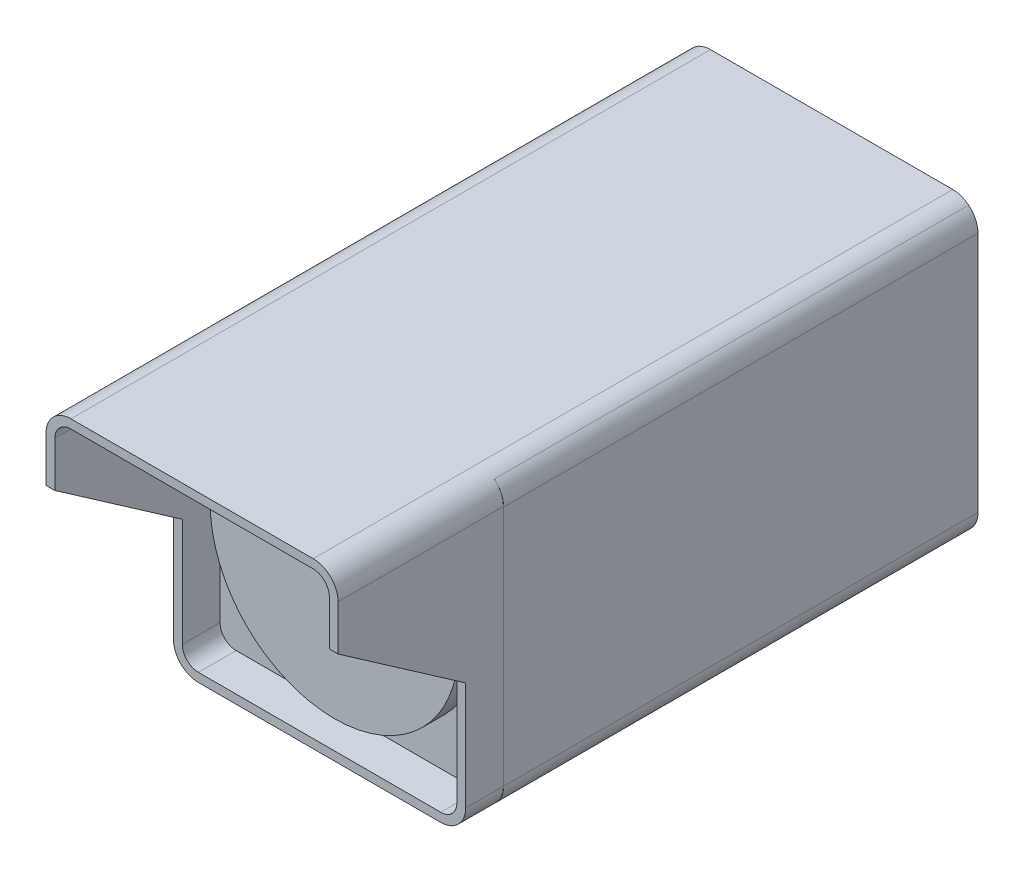
ISO-10303-21;
HEADER;
FILE_DESCRIPTION(('STEP AP214'),'2;1');
FILE_NAME('part.step','',(''),(''),'','','');
FILE_SCHEMA(('AUTOMOTIVE_DESIGN { 1 0 10303 214 1 1 1 1 }'));
ENDSEC;
DATA;
#1=APPLICATION_CONTEXT('core data for automotive mechanical design processes');
#2=APPLICATION_PROTOCOL_DEFINITION('international standard','automotive_design',2000,#1);
#3=PRODUCT_CONTEXT('',#1,'mechanical');
#4=PRODUCT('Part','Part','',(#3));
#5=PRODUCT_RELATED_PRODUCT_CATEGORY('part','',(#4));
#6=PRODUCT_DEFINITION_FORMATION('','',#4);
#7=PRODUCT_DEFINITION_CONTEXT('part definition',#1,'design');
#8=PRODUCT_DEFINITION('design','',#6,#7);
#9=PRODUCT_DEFINITION_SHAPE('','',#8);
#10=(LENGTH_UNIT() NAMED_UNIT(*) SI_UNIT(.MILLI.,.METRE.));
#11=(NAMED_UNIT(*) PLANE_ANGLE_UNIT() SI_UNIT($,.RADIAN.));
#12=(NAMED_UNIT(*) SI_UNIT($,.STERADIAN.) SOLID_ANGLE_UNIT());
#13=UNCERTAINTY_MEASURE_WITH_UNIT(LENGTH_MEASURE(1.E-05),#10,'distance_accuracy_value','');
#14=(GEOMETRIC_REPRESENTATION_CONTEXT(3) GLOBAL_UNCERTAINTY_ASSIGNED_CONTEXT((#13)) GLOBAL_UNIT_ASSIGNED_CONTEXT((#10,
#11,#12)) REPRESENTATION_CONTEXT('',''));
#15=CARTESIAN_POINT('',(0.,0.,0.));
#16=DIRECTION('',(0.,0.,1.));
#17=DIRECTION('',(1.,0.,0.));
#18=AXIS2_PLACEMENT_3D('',#15,#16,#17);
#19=CARTESIAN_POINT('',(-1458.22070940917,1458.22070940917,7698.));
#20=DIRECTION('',(0.,0.,1.));
#21=DIRECTION('',(1.,0.,0.));
#22=AXIS2_PLACEMENT_3D('',#19,#20,#21);
#23=PLANE('',#22);
#24=DIRECTION('',(1.,0.,0.));
#25=VECTOR('',#24,1.);
#26=CARTESIAN_POINT('',(-3950.77929059083,914.449134533678,7698.));
#27=LINE('',#26,#25);
#28=CARTESIAN_POINT('',(1652.22070940917,914.449134533678,7698.));
#29=VERTEX_POINT('',#28);
#30=CARTESIAN_POINT('',(1758.22070940917,914.449134533678,7698.));
#31=VERTEX_POINT('',#30);
#32=EDGE_CURVE('E275',#29,#31,#27,.T.);
#33=ORIENTED_EDGE('',*,*,#32,.T.);
#34=DIRECTION('',(0.,1.,0.));
#35=VECTOR('',#34,1.);
#36=CARTESIAN_POINT('',(1758.22070940917,-1458.22070940917,7698.));
#37=LINE('',#36,#35);
#38=CARTESIAN_POINT('',(1758.22070940917,1458.22070940917,7698.));
#39=VERTEX_POINT('',#38);
#40=EDGE_CURVE('E285',#31,#39,#37,.T.);
#41=ORIENTED_EDGE('',*,*,#40,.T.);
#42=CARTESIAN_POINT('',(1458.22070940917,1458.22070940917,7698.));
#43=DIRECTION('',(0.,0.,1.));
#44=DIRECTION('',(1.,0.,0.));
#45=AXIS2_PLACEMENT_3D('',#42,#43,#44);
#46=CIRCLE('',#45,300.);
#47=CARTESIAN_POINT('',(1458.22070940917,1758.22070940917,7698.));
#48=VERTEX_POINT('',#47);
#49=EDGE_CURVE('E296',#39,#48,#46,.T.);
#50=ORIENTED_EDGE('',*,*,#49,.T.);
#51=DIRECTION('',(-1.,0.,0.));
#52=VECTOR('',#51,1.);
#53=CARTESIAN_POINT('',(1458.22070940917,1758.22070940917,7698.));
#54=LINE('',#53,#52);
#55=CARTESIAN_POINT('',(-1458.22070940917,1758.22070940917,7698.));
#56=VERTEX_POINT('',#55);
#57=EDGE_CURVE('E301',#48,#56,#54,.T.);
#58=ORIENTED_EDGE('',*,*,#57,.T.);
#59=CARTESIAN_POINT('',(-1458.22070940917,1458.22070940917,7698.));
#60=DIRECTION('',(0.,0.,1.));
#61=DIRECTION('',(1.,0.,0.));
#62=AXIS2_PLACEMENT_3D('',#59,#60,#61);
#63=CIRCLE('',#62,300.);
#64=CARTESIAN_POINT('',(-1758.22070940917,1458.22070940917,7698.));
#65=VERTEX_POINT('',#64);
#66=EDGE_CURVE('E491',#56,#65,#63,.T.);
#67=ORIENTED_EDGE('',*,*,#66,.T.);
#68=DIRECTION('',(0.,1.,0.));
#69=VECTOR('',#68,1.);
#70=CARTESIAN_POINT('',(-1758.22070940917,-1458.22070940917,7698.));
#71=LINE('',#70,#69);
#72=CARTESIAN_POINT('',(-1758.22070940917,914.449134533678,7698.));
#73=VERTEX_POINT('',#72);
#74=EDGE_CURVE('E320',#73,#65,#71,.T.);
#75=ORIENTED_EDGE('',*,*,#74,.F.);
#76=CARTESIAN_POINT('',(-1652.22070940917,914.449134533678,7698.));
#77=VERTEX_POINT('',#76);
#78=EDGE_CURVE('E289',#73,#77,#27,.T.);
#79=ORIENTED_EDGE('',*,*,#78,.T.);
#80=DIRECTION('',(0.,1.,0.));
#81=VECTOR('',#80,1.);
#82=CARTESIAN_POINT('',(-1652.22070940917,-1458.22070940917,7698.));
#83=LINE('',#82,#81);
#84=CARTESIAN_POINT('',(-1652.22070940917,1458.22070940917,7698.));
#85=VERTEX_POINT('',#84);
#86=EDGE_CURVE('E471',#77,#85,#83,.T.);
#87=ORIENTED_EDGE('',*,*,#86,.T.);
#88=CARTESIAN_POINT('',(-1458.22070940917,1458.22070940917,7698.));
#89=DIRECTION('',(0.,0.,1.));
#90=DIRECTION('',(1.,0.,0.));
#91=AXIS2_PLACEMENT_3D('',#88,#89,#90);
#92=CIRCLE('',#91,194.);
#93=CARTESIAN_POINT('',(-1458.22070940917,1652.22070940917,7698.));
#94=VERTEX_POINT('',#93);
#95=EDGE_CURVE('E468',#94,#85,#92,.T.);
#96=ORIENTED_EDGE('',*,*,#95,.F.);
#97=DIRECTION('',(-1.,0.,0.));
#98=VECTOR('',#97,1.);
#99=CARTESIAN_POINT('',(1458.22070940917,1652.22070940917,7698.));
#100=LINE('',#99,#98);
#101=CARTESIAN_POINT('',(1458.22070940917,1652.22070940917,7698.));
#102=VERTEX_POINT('',#101);
#103=EDGE_CURVE('E466',#102,#94,#100,.T.);
#104=ORIENTED_EDGE('',*,*,#103,.F.);
#105=CARTESIAN_POINT('',(1458.22070940917,1458.22070940917,7698.));
#106=DIRECTION('',(0.,0.,1.));
#107=DIRECTION('',(1.,0.,0.));
#108=AXIS2_PLACEMENT_3D('',#105,#106,#107);
#109=CIRCLE('',#108,194.);
#110=CARTESIAN_POINT('',(1652.22070940917,1458.22070940917,7698.));
#111=VERTEX_POINT('',#110);
#112=EDGE_CURVE('E464',#111,#102,#109,.T.);
#113=ORIENTED_EDGE('',*,*,#112,.F.);
#114=DIRECTION('',(0.,1.,0.));
#115=VECTOR('',#114,1.);
#116=CARTESIAN_POINT('',(1652.22070940917,-1458.22070940917,7698.));
#117=LINE('',#116,#115);
#118=EDGE_CURVE('E288',#29,#111,#117,.T.);
#119=ORIENTED_EDGE('',*,*,#118,.F.);
#120=EDGE_LOOP('',(#33,#41,#50,#58,#67,#75,#79,#87,#96,#104,#113,#119));
#121=FACE_BOUND('',#120,.T.);
#122=ADVANCED_FACE('F88',(#121),#23,.T.);
#123=CARTESIAN_POINT('',(-1458.22070940917,1458.22070940917,0.));
#124=DIRECTION('',(0.,0.,1.));
#125=DIRECTION('',(1.,0.,0.));
#126=AXIS2_PLACEMENT_3D('',#123,#124,#125);
#127=PLANE('',#126);
#128=CARTESIAN_POINT('',(1462.26662348283,-1454.94787315382,0.));
#129=DIRECTION('',(0.,0.,-1.));
#130=DIRECTION('',(1.,0.,0.));
#131=AXIS2_PLACEMENT_3D('',#128,#129,#130);
#132=CIRCLE('',#131,300.);
#133=CARTESIAN_POINT('',(1762.26662348283,-1454.94787315382,0.));
#134=VERTEX_POINT('',#133);
#135=CARTESIAN_POINT('',(1648.91148484852,-1689.81740230944,0.));
#136=VERTEX_POINT('',#135);
#137=EDGE_CURVE('E389',#134,#136,#132,.T.);
#138=ORIENTED_EDGE('',*,*,#137,.T.);
#139=CARTESIAN_POINT('',(1458.22070940917,-1458.22070940917,0.));
#140=DIRECTION('',(0.,0.,1.));
#141=DIRECTION('',(1.,0.,0.));
#142=AXIS2_PLACEMENT_3D('',#139,#140,#141);
#143=CIRCLE('',#142,300.);
#144=CARTESIAN_POINT('',(1458.22070940917,-1758.22070940917,0.));
#145=VERTEX_POINT('',#144);
#146=EDGE_CURVE('E312',#145,#136,#143,.T.);
#147=ORIENTED_EDGE('',*,*,#146,.F.);
#148=DIRECTION('',(-1.,0.,0.));
#149=VECTOR('',#148,1.);
#150=CARTESIAN_POINT('',(1458.22070940917,-1758.22070940917,0.));
#151=LINE('',#150,#149);
#152=CARTESIAN_POINT('',(-1458.22070940917,-1758.22070940917,0.));
#153=VERTEX_POINT('',#152);
#154=EDGE_CURVE('E314',#145,#153,#151,.T.);
#155=ORIENTED_EDGE('',*,*,#154,.T.);
#156=CARTESIAN_POINT('',(-1458.22070940917,-1458.22070940917,0.));
#157=DIRECTION('',(0.,0.,-1.));
#158=DIRECTION('',(-1.,0.,0.));
#159=AXIS2_PLACEMENT_3D('',#156,#157,#158);
#160=CIRCLE('',#159,300.);
#161=CARTESIAN_POINT('',(-1648.91148484851,-1689.81740230945,0.));
#162=VERTEX_POINT('',#161);
#163=EDGE_CURVE('E317',#153,#162,#160,.T.);
#164=ORIENTED_EDGE('',*,*,#163,.T.);
#165=CARTESIAN_POINT('',(-1462.26662348283,-1454.94787315382,0.));
#166=DIRECTION('',(0.,0.,-1.));
#167=DIRECTION('',(-1.,0.,0.));
#168=AXIS2_PLACEMENT_3D('',#165,#166,#167);
#169=CIRCLE('',#168,300.);
#170=CARTESIAN_POINT('',(-1762.26662348283,-1454.94787315382,0.));
#171=VERTEX_POINT('',#170);
#172=EDGE_CURVE('E410',#162,#171,#169,.T.);
#173=ORIENTED_EDGE('',*,*,#172,.T.);
#174=DIRECTION('',(0.,1.,0.));
#175=VECTOR('',#174,1.);
#176=CARTESIAN_POINT('',(-1762.26662348283,-1454.94787315382,0.));
#177=LINE('',#176,#175);
#178=CARTESIAN_POINT('',(-1762.26662348283,1454.94787315382,0.));
#179=VERTEX_POINT('',#178);
#180=EDGE_CURVE('E412',#171,#179,#177,.T.);
#181=ORIENTED_EDGE('',*,*,#180,.T.);
#182=CARTESIAN_POINT('',(-1462.26662348283,1454.94787315382,0.));
#183=DIRECTION('',(0.,0.,-1.));
#184=DIRECTION('',(-1.,0.,0.));
#185=AXIS2_PLACEMENT_3D('',#182,#183,#184);
#186=CIRCLE('',#185,300.);
#187=CARTESIAN_POINT('',(-1648.9114848485,1689.81740230945,0.));
#188=VERTEX_POINT('',#187);
#189=EDGE_CURVE('E415',#179,#188,#186,.T.);
#190=ORIENTED_EDGE('',*,*,#189,.T.);
#191=CARTESIAN_POINT('',(-1458.22070940917,1458.22070940917,0.));
#192=DIRECTION('',(0.,0.,1.));
#193=DIRECTION('',(1.,0.,0.));
#194=AXIS2_PLACEMENT_3D('',#191,#192,#193);
#195=CIRCLE('',#194,300.);
#196=CARTESIAN_POINT('',(-1458.22070940917,1758.22070940917,0.));
#197=VERTEX_POINT('',#196);
#198=EDGE_CURVE('E305',#197,#188,#195,.T.);
#199=ORIENTED_EDGE('',*,*,#198,.F.);
#200=DIRECTION('',(-1.,0.,0.));
#201=VECTOR('',#200,1.);
#202=CARTESIAN_POINT('',(1458.22070940917,1758.22070940917,0.));
#203=LINE('',#202,#201);
#204=CARTESIAN_POINT('',(1458.22070940917,1758.22070940917,0.));
#205=VERTEX_POINT('',#204);
#206=EDGE_CURVE('E307',#205,#197,#203,.T.);
#207=ORIENTED_EDGE('',*,*,#206,.F.);
#208=CARTESIAN_POINT('',(1458.22070940917,1458.22070940917,0.));
#209=DIRECTION('',(0.,0.,1.));
#210=DIRECTION('',(1.,0.,0.));
#211=AXIS2_PLACEMENT_3D('',#208,#209,#210);
#212=CIRCLE('',#211,300.);
#213=CARTESIAN_POINT('',(1648.91148484852,1689.81740230944,0.));
#214=VERTEX_POINT('',#213);
#215=EDGE_CURVE('E310',#214,#205,#212,.T.);
#216=ORIENTED_EDGE('',*,*,#215,.F.);
#217=CARTESIAN_POINT('',(1462.26662348283,1454.94787315382,0.));
#218=DIRECTION('',(0.,0.,-1.));
#219=DIRECTION('',(-1.,0.,0.));
#220=AXIS2_PLACEMENT_3D('',#217,#218,#219);
#221=CIRCLE('',#220,300.);
#222=CARTESIAN_POINT('',(1762.26662348283,1454.94787315382,0.));
#223=VERTEX_POINT('',#222);
#224=EDGE_CURVE('E418',#214,#223,#221,.T.);
#225=ORIENTED_EDGE('',*,*,#224,.T.);
#226=DIRECTION('',(0.,-1.,0.));
#227=VECTOR('',#226,1.);
#228=CARTESIAN_POINT('',(1762.26662348283,-1454.94787315382,0.));
#229=LINE('',#228,#227);
#230=EDGE_CURVE('E394',#223,#134,#229,.T.);
#231=ORIENTED_EDGE('',*,*,#230,.T.);
#232=EDGE_LOOP('',(#138,#147,#155,#164,#173,#181,#190,#199,#207,#216,#225,#231));
#233=FACE_BOUND('',#232,.T.);
#234=ADVANCED_FACE('F524',(#233),#127,.F.);
#235=CARTESIAN_POINT('',(-1758.22070940917,-1458.22070940917,7698.));
#236=DIRECTION('',(-1.,0.,0.));
#237=DIRECTION('',(0.,0.,1.));
#238=AXIS2_PLACEMENT_3D('',#235,#236,#237);
#239=PLANE('',#238);
#240=DIRECTION('',(0.,-0.571304206053367,-0.820738389589358));
#241=VECTOR('',#240,1.);
#242=CARTESIAN_POINT('',(-1758.22070940917,140.036993010392,6585.47576653952));
#243=LINE('',#242,#241);
#244=CARTESIAN_POINT('',(-1758.22070940917,-153.979819583542,6163.08978946517));
#245=VERTEX_POINT('',#244);
#246=EDGE_CURVE('E387',#73,#245,#243,.T.);
#247=ORIENTED_EDGE('',*,*,#246,.F.);
#248=ORIENTED_EDGE('',*,*,#74,.T.);
#249=DIRECTION('',(0.,0.,-1.));
#250=VECTOR('',#249,1.);
#251=CARTESIAN_POINT('',(-1758.22070940917,1458.22070940917,7698.));
#252=LINE('',#251,#250);
#253=CARTESIAN_POINT('',(-1758.22070940917,1458.22070940917,5709.));
#254=VERTEX_POINT('',#253);
#255=EDGE_CURVE('E295',#65,#254,#252,.T.);
#256=ORIENTED_EDGE('',*,*,#255,.T.);
#257=DIRECTION('',(0.,1.,0.));
#258=VECTOR('',#257,1.);
#259=CARTESIAN_POINT('',(-1758.22070940917,-1458.22070940917,5709.));
#260=LINE('',#259,#258);
#261=CARTESIAN_POINT('',(-1758.22070940917,-1458.22070940917,5709.));
#262=VERTEX_POINT('',#261);
#263=EDGE_CURVE('E453',#262,#254,#260,.T.);
#264=ORIENTED_EDGE('',*,*,#263,.F.);
#265=DIRECTION('',(0.,0.,-1.));
#266=VECTOR('',#265,1.);
#267=CARTESIAN_POINT('',(-1758.22070940917,-1458.22070940917,7698.));
#268=LINE('',#267,#266);
#269=CARTESIAN_POINT('',(-1758.22070940917,-1458.22070940917,6163.08978946517));
#270=VERTEX_POINT('',#269);
#271=EDGE_CURVE('E321',#270,#262,#268,.T.);
#272=ORIENTED_EDGE('',*,*,#271,.F.);
#273=DIRECTION('',(0.,-1.,0.));
#274=VECTOR('',#273,1.);
#275=CARTESIAN_POINT('',(-1758.22070940917,-1458.22070940917,6163.08978946517));
#276=LINE('',#275,#274);
#277=EDGE_CURVE('E382',#245,#270,#276,.T.);
#278=ORIENTED_EDGE('',*,*,#277,.F.);
#279=EDGE_LOOP('',(#247,#248,#256,#264,#272,#278));
#280=FACE_BOUND('',#279,.T.);
#281=ADVANCED_FACE('F90',(#280),#239,.T.);
#282=CARTESIAN_POINT('',(-1458.22070940917,-1458.22070940917,7698.));
#283=DIRECTION('',(0.,0.,-1.));
#284=DIRECTION('',(-1.,0.,0.));
#285=AXIS2_PLACEMENT_3D('',#282,#283,#284);
#286=CYLINDRICAL_SURFACE('',#285,300.);
#287=CARTESIAN_POINT('',(-1458.22070940917,-1458.22070940917,6163.08978946517));
#288=DIRECTION('',(0.,0.,-1.));
#289=DIRECTION('',(-1.,0.,0.));
#290=AXIS2_PLACEMENT_3D('',#287,#288,#289);
#291=CIRCLE('',#290,300.);
#292=CARTESIAN_POINT('',(-1458.22070940917,-1758.22070940917,6163.08978946517));
#293=VERTEX_POINT('',#292);
#294=EDGE_CURVE('E380',#270,#293,#291,.F.);
#295=ORIENTED_EDGE('',*,*,#294,.F.);
#296=ORIENTED_EDGE('',*,*,#271,.T.);
#297=CARTESIAN_POINT('',(-1458.22070940917,-1458.22070940917,5709.));
#298=DIRECTION('',(0.,0.,1.));
#299=DIRECTION('',(1.,0.,0.));
#300=AXIS2_PLACEMENT_3D('',#297,#298,#299);
#301=CIRCLE('',#300,300.);
#302=CARTESIAN_POINT('',(-1648.91148484851,-1689.81740230945,5709.));
#303=VERTEX_POINT('',#302);
#304=EDGE_CURVE('E111',#303,#262,#301,.F.);
#305=ORIENTED_EDGE('',*,*,#304,.F.);
#306=DIRECTION('',(0.,0.,-1.));
#307=VECTOR('',#306,1.);
#308=CARTESIAN_POINT('',(-1648.91148484851,-1689.81740230945,2854.5));
#309=LINE('',#308,#307);
#310=EDGE_CURVE('E345',#162,#303,#309,.F.);
#311=ORIENTED_EDGE('',*,*,#310,.F.);
#312=ORIENTED_EDGE('',*,*,#163,.F.);
#313=DIRECTION('',(0.,0.,-1.));
#314=VECTOR('',#313,1.);
#315=CARTESIAN_POINT('',(-1458.22070940917,-1758.22070940917,7698.));
#316=LINE('',#315,#314);
#317=EDGE_CURVE('E324',#293,#153,#316,.T.);
#318=ORIENTED_EDGE('',*,*,#317,.F.);
#319=EDGE_LOOP('',(#295,#296,#305,#311,#312,#318));
#320=FACE_BOUND('',#319,.T.);
#321=ADVANCED_FACE('F530',(#320),#286,.T.);
#322=CARTESIAN_POINT('',(1458.22070940917,-1758.22070940917,7698.));
#323=DIRECTION('',(0.,-1.,0.));
#324=DIRECTION('',(1.,0.,0.));
#325=AXIS2_PLACEMENT_3D('',#322,#323,#324);
#326=PLANE('',#325);
#327=CARTESIAN_POINT('',(-1.33862940044909E-13,-1758.22070940917,1152.40114083708));
#328=DIRECTION('',(0.,-1.,0.));
#329=DIRECTION('',(1.,0.,0.));
#330=AXIS2_PLACEMENT_3D('',#327,#328,#329);
#331=CIRCLE('',#330,688.921896871844);
#332=CARTESIAN_POINT('',(688.921896871844,-1758.22070940917,1152.40114083708));
#333=VERTEX_POINT('',#332);
#334=EDGE_CURVE('E539',#333,#333,#331,.T.);
#335=ORIENTED_EDGE('',*,*,#334,.F.);
#336=EDGE_LOOP('',(#335));
#337=FACE_BOUND('',#336,.T.);
#338=DIRECTION('',(1.,0.,0.));
#339=VECTOR('',#338,1.);
#340=CARTESIAN_POINT('',(-3950.77929059083,-1758.22070940917,6163.08978946517));
#341=LINE('',#340,#339);
#342=CARTESIAN_POINT('',(1458.22070940917,-1758.22070940917,6163.08978946517));
#343=VERTEX_POINT('',#342);
#344=EDGE_CURVE('E535',#293,#343,#341,.T.);
#345=ORIENTED_EDGE('',*,*,#344,.F.);
#346=ORIENTED_EDGE('',*,*,#317,.T.);
#347=ORIENTED_EDGE('',*,*,#154,.F.);
#348=DIRECTION('',(0.,0.,-1.));
#349=VECTOR('',#348,1.);
#350=CARTESIAN_POINT('',(1458.22070940917,-1758.22070940917,7698.));
#351=LINE('',#350,#349);
#352=EDGE_CURVE('E326',#343,#145,#351,.T.);
#353=ORIENTED_EDGE('',*,*,#352,.F.);
#354=EDGE_LOOP('',(#345,#346,#347,#353));
#355=FACE_BOUND('',#354,.T.);
#356=ADVANCED_FACE('F533',(#337,#355),#326,.T.);
#357=CARTESIAN_POINT('',(1458.22070940917,-1458.22070940917,7698.));
#358=DIRECTION('',(0.,0.,-1.));
#359=DIRECTION('',(-1.,0.,0.));
#360=AXIS2_PLACEMENT_3D('',#357,#358,#359);
#361=CYLINDRICAL_SURFACE('',#360,300.);
#362=DIRECTION('',(0.,0.,-1.));
#363=VECTOR('',#362,1.);
#364=CARTESIAN_POINT('',(1758.22070940917,-1458.22070940917,7698.));
#365=LINE('',#364,#363);
#366=CARTESIAN_POINT('',(1758.22070940917,-1458.22070940917,6163.08978946517));
#367=VERTEX_POINT('',#366);
#368=CARTESIAN_POINT('',(1758.22070940917,-1458.22070940917,5709.));
#369=VERTEX_POINT('',#368);
#370=EDGE_CURVE('E328',#367,#369,#365,.T.);
#371=ORIENTED_EDGE('',*,*,#370,.F.);
#372=CARTESIAN_POINT('',(1458.22070940917,-1458.22070940917,6163.08978946517));
#373=DIRECTION('',(0.,0.,-1.));
#374=DIRECTION('',(-1.,0.,0.));
#375=AXIS2_PLACEMENT_3D('',#372,#373,#374);
#376=CIRCLE('',#375,300.);
#377=EDGE_CURVE('E377',#367,#343,#376,.T.);
#378=ORIENTED_EDGE('',*,*,#377,.T.);
#379=ORIENTED_EDGE('',*,*,#352,.T.);
#380=ORIENTED_EDGE('',*,*,#146,.T.);
#381=DIRECTION('',(0.,0.,-1.));
#382=VECTOR('',#381,1.);
#383=CARTESIAN_POINT('',(1648.91148484852,-1689.81740230944,2854.5));
#384=LINE('',#383,#382);
#385=CARTESIAN_POINT('',(1648.91148484852,-1689.81740230944,5709.));
#386=VERTEX_POINT('',#385);
#387=EDGE_CURVE('E343',#136,#386,#384,.F.);
#388=ORIENTED_EDGE('',*,*,#387,.T.);
#389=CARTESIAN_POINT('',(1458.22070940917,-1458.22070940917,5709.));
#390=DIRECTION('',(0.,0.,1.));
#391=DIRECTION('',(1.,0.,0.));
#392=AXIS2_PLACEMENT_3D('',#389,#390,#391);
#393=CIRCLE('',#392,300.);
#394=EDGE_CURVE('E461',#386,#369,#393,.T.);
#395=ORIENTED_EDGE('',*,*,#394,.T.);
#396=EDGE_LOOP('',(#371,#378,#379,#380,#388,#395));
#397=FACE_BOUND('',#396,.T.);
#398=ADVANCED_FACE('F622',(#397),#361,.T.);
#399=CARTESIAN_POINT('',(1758.22070940917,-1458.22070940917,7698.));
#400=DIRECTION('',(-1.,0.,0.));
#401=DIRECTION('',(0.,-1.,0.));
#402=AXIS2_PLACEMENT_3D('',#399,#400,#401);
#403=PLANE('',#402);
#404=ORIENTED_EDGE('',*,*,#40,.F.);
#405=DIRECTION('',(0.,0.571304206053367,0.820738389589358));
#406=VECTOR('',#405,1.);
#407=CARTESIAN_POINT('',(1758.22070940917,-153.979819583542,6163.08978946517));
#408=LINE('',#407,#406);
#409=CARTESIAN_POINT('',(1758.22070940917,-153.979819583542,6163.08978946517));
#410=VERTEX_POINT('',#409);
#411=EDGE_CURVE('E272',#410,#31,#408,.T.);
#412=ORIENTED_EDGE('',*,*,#411,.F.);
#413=DIRECTION('',(0.,1.,0.));
#414=VECTOR('',#413,1.);
#415=CARTESIAN_POINT('',(1758.22070940917,-1758.22070940917,6163.08978946517));
#416=LINE('',#415,#414);
#417=EDGE_CURVE('E280',#367,#410,#416,.T.);
#418=ORIENTED_EDGE('',*,*,#417,.F.);
#419=ORIENTED_EDGE('',*,*,#370,.T.);
#420=DIRECTION('',(0.,1.,0.));
#421=VECTOR('',#420,1.);
#422=CARTESIAN_POINT('',(1758.22070940917,-1458.22070940917,5709.));
#423=LINE('',#422,#421);
#424=CARTESIAN_POINT('',(1758.22070940917,1458.22070940917,5709.));
#425=VERTEX_POINT('',#424);
#426=EDGE_CURVE('E459',#369,#425,#423,.T.);
#427=ORIENTED_EDGE('',*,*,#426,.T.);
#428=DIRECTION('',(0.,0.,-1.));
#429=VECTOR('',#428,1.);
#430=CARTESIAN_POINT('',(1758.22070940917,1458.22070940917,7698.));
#431=LINE('',#430,#429);
#432=EDGE_CURVE('E293',#39,#425,#431,.T.);
#433=ORIENTED_EDGE('',*,*,#432,.F.);
#434=EDGE_LOOP('',(#404,#412,#418,#419,#427,#433));
#435=FACE_BOUND('',#434,.T.);
#436=ADVANCED_FACE('F291',(#435),#403,.F.);
#437=CARTESIAN_POINT('',(1458.22070940917,1458.22070940917,7698.));
#438=DIRECTION('',(0.,0.,-1.));
#439=DIRECTION('',(-1.,0.,0.));
#440=AXIS2_PLACEMENT_3D('',#437,#438,#439);
#441=CYLINDRICAL_SURFACE('',#440,300.);
#442=CARTESIAN_POINT('',(1458.22070940917,1458.22070940917,5709.));
#443=DIRECTION('',(0.,0.,1.));
#444=DIRECTION('',(1.,0.,0.));
#445=AXIS2_PLACEMENT_3D('',#442,#443,#444);
#446=CIRCLE('',#445,300.);
#447=CARTESIAN_POINT('',(1648.91148484852,1689.81740230944,5709.));
#448=VERTEX_POINT('',#447);
#449=EDGE_CURVE('E457',#425,#448,#446,.T.);
#450=ORIENTED_EDGE('',*,*,#449,.T.);
#451=DIRECTION('',(0.,0.,-1.));
#452=VECTOR('',#451,1.);
#453=CARTESIAN_POINT('',(1648.91148484852,1689.81740230944,2854.5));
#454=LINE('',#453,#452);
#455=EDGE_CURVE('E340',#448,#214,#454,.T.);
#456=ORIENTED_EDGE('',*,*,#455,.T.);
#457=ORIENTED_EDGE('',*,*,#215,.T.);
#458=DIRECTION('',(0.,0.,-1.));
#459=VECTOR('',#458,1.);
#460=CARTESIAN_POINT('',(1458.22070940917,1758.22070940917,7698.));
#461=LINE('',#460,#459);
#462=EDGE_CURVE('E331',#48,#205,#461,.T.);
#463=ORIENTED_EDGE('',*,*,#462,.F.);
#464=ORIENTED_EDGE('',*,*,#49,.F.);
#465=ORIENTED_EDGE('',*,*,#432,.T.);
#466=EDGE_LOOP('',(#450,#456,#457,#463,#464,#465));
#467=FACE_BOUND('',#466,.T.);
#468=ADVANCED_FACE('F629',(#467),#441,.T.);
#469=CARTESIAN_POINT('',(1458.22070940917,1758.22070940917,7698.));
#470=DIRECTION('',(0.,-1.,0.));
#471=DIRECTION('',(1.,0.,0.));
#472=AXIS2_PLACEMENT_3D('',#469,#470,#471);
#473=PLANE('',#472);
#474=ORIENTED_EDGE('',*,*,#206,.T.);
#475=DIRECTION('',(0.,0.,-1.));
#476=VECTOR('',#475,1.);
#477=CARTESIAN_POINT('',(-1458.22070940917,1758.22070940917,7698.));
#478=LINE('',#477,#476);
#479=EDGE_CURVE('E299',#56,#197,#478,.T.);
#480=ORIENTED_EDGE('',*,*,#479,.F.);
#481=ORIENTED_EDGE('',*,*,#57,.F.);
#482=ORIENTED_EDGE('',*,*,#462,.T.);
#483=EDGE_LOOP('',(#474,#480,#481,#482));
#484=FACE_BOUND('',#483,.T.);
#485=ADVANCED_FACE('F500',(#484),#473,.F.);
#486=CARTESIAN_POINT('',(-1458.22070940917,1458.22070940917,7698.));
#487=DIRECTION('',(0.,0.,-1.));
#488=DIRECTION('',(-1.,0.,0.));
#489=AXIS2_PLACEMENT_3D('',#486,#487,#488);
#490=CYLINDRICAL_SURFACE('',#489,300.);
#491=ORIENTED_EDGE('',*,*,#198,.T.);
#492=DIRECTION('',(0.,0.,-1.));
#493=VECTOR('',#492,1.);
#494=CARTESIAN_POINT('',(-1648.9114848485,1689.81740230945,2854.5));
#495=LINE('',#494,#493);
#496=CARTESIAN_POINT('',(-1648.9114848485,1689.81740230945,5709.));
#497=VERTEX_POINT('',#496);
#498=EDGE_CURVE('E338',#188,#497,#495,.F.);
#499=ORIENTED_EDGE('',*,*,#498,.T.);
#500=CARTESIAN_POINT('',(-1458.22070940917,1458.22070940917,5709.));
#501=DIRECTION('',(0.,0.,1.));
#502=DIRECTION('',(1.,0.,0.));
#503=AXIS2_PLACEMENT_3D('',#500,#501,#502);
#504=CIRCLE('',#503,300.);
#505=EDGE_CURVE('E451',#497,#254,#504,.T.);
#506=ORIENTED_EDGE('',*,*,#505,.T.);
#507=ORIENTED_EDGE('',*,*,#255,.F.);
#508=ORIENTED_EDGE('',*,*,#66,.F.);
#509=ORIENTED_EDGE('',*,*,#479,.T.);
#510=EDGE_LOOP('',(#491,#499,#506,#507,#508,#509));
#511=FACE_BOUND('',#510,.T.);
#512=ADVANCED_FACE('F504',(#511),#490,.T.);
#513=CARTESIAN_POINT('',(1458.22070940917,1458.22070940917,7698.));
#514=DIRECTION('',(0.,0.,-1.));
#515=DIRECTION('',(-1.,0.,0.));
#516=AXIS2_PLACEMENT_3D('',#513,#514,#515);
#517=CYLINDRICAL_SURFACE('',#516,194.);
#518=CARTESIAN_POINT('',(1458.22070940917,1458.22070940917,5709.));
#519=DIRECTION('',(0.,0.,1.));
#520=DIRECTION('',(1.,0.,0.));
#521=AXIS2_PLACEMENT_3D('',#518,#519,#520);
#522=CIRCLE('',#521,194.);
#523=CARTESIAN_POINT('',(1652.22070940917,1458.22070940917,5709.));
#524=VERTEX_POINT('',#523);
#525=CARTESIAN_POINT('',(1458.22070940917,1652.22070940917,5709.));
#526=VERTEX_POINT('',#525);
#527=EDGE_CURVE('E448',#524,#526,#522,.T.);
#528=ORIENTED_EDGE('',*,*,#527,.F.);
#529=DIRECTION('',(0.,0.,-1.));
#530=VECTOR('',#529,1.);
#531=CARTESIAN_POINT('',(1652.22070940917,1458.22070940917,7698.));
#532=LINE('',#531,#530);
#533=EDGE_CURVE('E474',#111,#524,#532,.T.);
#534=ORIENTED_EDGE('',*,*,#533,.F.);
#535=ORIENTED_EDGE('',*,*,#112,.T.);
#536=DIRECTION('',(0.,0.,-1.));
#537=VECTOR('',#536,1.);
#538=CARTESIAN_POINT('',(1458.22070940917,1652.22070940917,7698.));
#539=LINE('',#538,#537);
#540=EDGE_CURVE('E308',#102,#526,#539,.T.);
#541=ORIENTED_EDGE('',*,*,#540,.T.);
#542=EDGE_LOOP('',(#528,#534,#535,#541));
#543=FACE_BOUND('',#542,.T.);
#544=ADVANCED_FACE('F572',(#543),#517,.F.);
#545=CARTESIAN_POINT('',(1458.22070940917,1652.22070940917,7698.));
#546=DIRECTION('',(0.,-1.,0.));
#547=DIRECTION('',(0.,0.,-1.));
#548=AXIS2_PLACEMENT_3D('',#545,#546,#547);
#549=PLANE('',#548);
#550=DIRECTION('',(-1.,0.,0.));
#551=VECTOR('',#550,1.);
#552=CARTESIAN_POINT('',(1458.22070940917,1652.22070940917,5709.));
#553=LINE('',#552,#551);
#554=CARTESIAN_POINT('',(-1458.22070940917,1652.22070940917,5709.));
#555=VERTEX_POINT('',#554);
#556=EDGE_CURVE('E445',#526,#555,#553,.T.);
#557=ORIENTED_EDGE('',*,*,#556,.F.);
#558=ORIENTED_EDGE('',*,*,#540,.F.);
#559=ORIENTED_EDGE('',*,*,#103,.T.);
#560=DIRECTION('',(0.,0.,-1.));
#561=VECTOR('',#560,1.);
#562=CARTESIAN_POINT('',(-1458.22070940917,1652.22070940917,7698.));
#563=LINE('',#562,#561);
#564=EDGE_CURVE('E485',#94,#555,#563,.T.);
#565=ORIENTED_EDGE('',*,*,#564,.T.);
#566=EDGE_LOOP('',(#557,#558,#559,#565));
#567=FACE_BOUND('',#566,.T.);
#568=ADVANCED_FACE('F576',(#567),#549,.T.);
#569=CARTESIAN_POINT('',(-1458.22070940917,1458.22070940917,7698.));
#570=DIRECTION('',(0.,0.,-1.));
#571=DIRECTION('',(-1.,0.,0.));
#572=AXIS2_PLACEMENT_3D('',#569,#570,#571);
#573=CYLINDRICAL_SURFACE('',#572,194.);
#574=CARTESIAN_POINT('',(-1458.22070940917,1458.22070940917,5709.));
#575=DIRECTION('',(0.,0.,1.));
#576=DIRECTION('',(1.,0.,0.));
#577=AXIS2_PLACEMENT_3D('',#574,#575,#576);
#578=CIRCLE('',#577,194.);
#579=CARTESIAN_POINT('',(-1652.22070940917,1458.22070940917,5709.));
#580=VERTEX_POINT('',#579);
#581=EDGE_CURVE('E442',#555,#580,#578,.T.);
#582=ORIENTED_EDGE('',*,*,#581,.F.);
#583=ORIENTED_EDGE('',*,*,#564,.F.);
#584=ORIENTED_EDGE('',*,*,#95,.T.);
#585=DIRECTION('',(0.,0.,-1.));
#586=VECTOR('',#585,1.);
#587=CARTESIAN_POINT('',(-1652.22070940917,1458.22070940917,7698.));
#588=LINE('',#587,#586);
#589=EDGE_CURVE('E482',#85,#580,#588,.T.);
#590=ORIENTED_EDGE('',*,*,#589,.T.);
#591=EDGE_LOOP('',(#582,#583,#584,#590));
#592=FACE_BOUND('',#591,.T.);
#593=ADVANCED_FACE('F582',(#592),#573,.F.);
#594=CARTESIAN_POINT('',(-1652.22070940917,-1458.22070940917,7698.));
#595=DIRECTION('',(-1.,0.,0.));
#596=DIRECTION('',(0.,-1.,0.));
#597=AXIS2_PLACEMENT_3D('',#594,#595,#596);
#598=PLANE('',#597);
#599=ORIENTED_EDGE('',*,*,#86,.F.);
#600=DIRECTION('',(0.,-0.571304206053367,-0.820738389589358));
#601=VECTOR('',#600,1.);
#602=CARTESIAN_POINT('',(-1652.22070940917,140.036993010392,6585.47576653952));
#603=LINE('',#602,#601);
#604=CARTESIAN_POINT('',(-1652.22070940917,-153.979819583542,6163.08978946517));
#605=VERTEX_POINT('',#604);
#606=EDGE_CURVE('E384',#77,#605,#603,.T.);
#607=ORIENTED_EDGE('',*,*,#606,.T.);
#608=DIRECTION('',(0.,-1.,0.));
#609=VECTOR('',#608,1.);
#610=CARTESIAN_POINT('',(-1652.22070940917,-1458.22070940917,6163.08978946517));
#611=LINE('',#610,#609);
#612=CARTESIAN_POINT('',(-1652.22070940917,-1458.22070940917,6163.08978946517));
#613=VERTEX_POINT('',#612);
#614=EDGE_CURVE('E374',#605,#613,#611,.T.);
#615=ORIENTED_EDGE('',*,*,#614,.T.);
#616=DIRECTION('',(0.,0.,-1.));
#617=VECTOR('',#616,1.);
#618=CARTESIAN_POINT('',(-1652.22070940917,-1458.22070940917,7698.));
#619=LINE('',#618,#617);
#620=CARTESIAN_POINT('',(-1652.22070940917,-1458.22070940917,5709.));
#621=VERTEX_POINT('',#620);
#622=EDGE_CURVE('E480',#613,#621,#619,.T.);
#623=ORIENTED_EDGE('',*,*,#622,.T.);
#624=DIRECTION('',(0.,1.,0.));
#625=VECTOR('',#624,1.);
#626=CARTESIAN_POINT('',(-1652.22070940917,-1458.22070940917,5709.));
#627=LINE('',#626,#625);
#628=EDGE_CURVE('E440',#621,#580,#627,.T.);
#629=ORIENTED_EDGE('',*,*,#628,.T.);
#630=ORIENTED_EDGE('',*,*,#589,.F.);
#631=EDGE_LOOP('',(#599,#607,#615,#623,#629,#630));
#632=FACE_BOUND('',#631,.T.);
#633=ADVANCED_FACE('F584',(#632),#598,.F.);
#634=CARTESIAN_POINT('',(-1458.22070940917,-1458.22070940917,7698.));
#635=DIRECTION('',(0.,0.,-1.));
#636=DIRECTION('',(-1.,0.,0.));
#637=AXIS2_PLACEMENT_3D('',#634,#635,#636);
#638=CYLINDRICAL_SURFACE('',#637,194.);
#639=ORIENTED_EDGE('',*,*,#622,.F.);
#640=CARTESIAN_POINT('',(-1458.22070940917,-1458.22070940917,6163.08978946517));
#641=DIRECTION('',(0.,0.,-1.));
#642=DIRECTION('',(-1.,0.,0.));
#643=AXIS2_PLACEMENT_3D('',#640,#641,#642);
#644=CIRCLE('',#643,194.);
#645=CARTESIAN_POINT('',(-1458.22070940917,-1652.22070940917,6163.08978946517));
#646=VERTEX_POINT('',#645);
#647=EDGE_CURVE('E366',#613,#646,#644,.F.);
#648=ORIENTED_EDGE('',*,*,#647,.T.);
#649=DIRECTION('',(0.,0.,-1.));
#650=VECTOR('',#649,1.);
#651=CARTESIAN_POINT('',(-1458.22070940917,-1652.22070940917,7698.));
#652=LINE('',#651,#650);
#653=CARTESIAN_POINT('',(-1458.22070940917,-1652.22070940917,5709.));
#654=VERTEX_POINT('',#653);
#655=EDGE_CURVE('E478',#646,#654,#652,.T.);
#656=ORIENTED_EDGE('',*,*,#655,.T.);
#657=CARTESIAN_POINT('',(-1458.22070940917,-1458.22070940917,5709.));
#658=DIRECTION('',(0.,0.,1.));
#659=DIRECTION('',(1.,0.,0.));
#660=AXIS2_PLACEMENT_3D('',#657,#658,#659);
#661=CIRCLE('',#660,194.);
#662=EDGE_CURVE('E437',#654,#621,#661,.F.);
#663=ORIENTED_EDGE('',*,*,#662,.T.);
#664=EDGE_LOOP('',(#639,#648,#656,#663));
#665=FACE_BOUND('',#664,.T.);
#666=ADVANCED_FACE('F589',(#665),#638,.F.);
#667=CARTESIAN_POINT('',(1458.22070940917,-1652.22070940917,7698.));
#668=DIRECTION('',(0.,-1.,0.));
#669=DIRECTION('',(1.,0.,0.));
#670=AXIS2_PLACEMENT_3D('',#667,#668,#669);
#671=PLANE('',#670);
#672=ORIENTED_EDGE('',*,*,#655,.F.);
#673=DIRECTION('',(1.,0.,0.));
#674=VECTOR('',#673,1.);
#675=CARTESIAN_POINT('',(1458.22070940917,-1652.22070940917,6163.08978946517));
#676=LINE('',#675,#674);
#677=CARTESIAN_POINT('',(1458.22070940917,-1652.22070940917,6163.08978946517));
#678=VERTEX_POINT('',#677);
#679=EDGE_CURVE('E363',#646,#678,#676,.T.);
#680=ORIENTED_EDGE('',*,*,#679,.T.);
#681=DIRECTION('',(0.,0.,-1.));
#682=VECTOR('',#681,1.);
#683=CARTESIAN_POINT('',(1458.22070940917,-1652.22070940917,7698.));
#684=LINE('',#683,#682);
#685=CARTESIAN_POINT('',(1458.22070940917,-1652.22070940917,5709.));
#686=VERTEX_POINT('',#685);
#687=EDGE_CURVE('E362',#678,#686,#684,.T.);
#688=ORIENTED_EDGE('',*,*,#687,.T.);
#689=DIRECTION('',(-1.,0.,0.));
#690=VECTOR('',#689,1.);
#691=CARTESIAN_POINT('',(1458.22070940917,-1652.22070940917,5709.));
#692=LINE('',#691,#690);
#693=EDGE_CURVE('E434',#686,#654,#692,.T.);
#694=ORIENTED_EDGE('',*,*,#693,.T.);
#695=EDGE_LOOP('',(#672,#680,#688,#694));
#696=FACE_BOUND('',#695,.T.);
#697=ADVANCED_FACE('F592',(#696),#671,.F.);
#698=CARTESIAN_POINT('',(1458.22070940917,-1458.22070940917,7698.));
#699=DIRECTION('',(0.,0.,-1.));
#700=DIRECTION('',(-1.,0.,0.));
#701=AXIS2_PLACEMENT_3D('',#698,#699,#700);
#702=CYLINDRICAL_SURFACE('',#701,194.);
#703=CARTESIAN_POINT('',(1458.22070940917,-1458.22070940917,6163.08978946517));
#704=DIRECTION('',(0.,0.,-1.));
#705=DIRECTION('',(-1.,0.,0.));
#706=AXIS2_PLACEMENT_3D('',#703,#704,#705);
#707=CIRCLE('',#706,194.);
#708=CARTESIAN_POINT('',(1652.22070940917,-1458.22070940917,6163.08978946517));
#709=VERTEX_POINT('',#708);
#710=EDGE_CURVE('E356',#709,#678,#707,.T.);
#711=ORIENTED_EDGE('',*,*,#710,.F.);
#712=DIRECTION('',(0.,0.,-1.));
#713=VECTOR('',#712,1.);
#714=CARTESIAN_POINT('',(1652.22070940917,-1458.22070940917,7698.));
#715=LINE('',#714,#713);
#716=CARTESIAN_POINT('',(1652.22070940917,-1458.22070940917,5709.));
#717=VERTEX_POINT('',#716);
#718=EDGE_CURVE('E353',#709,#717,#715,.T.);
#719=ORIENTED_EDGE('',*,*,#718,.T.);
#720=CARTESIAN_POINT('',(1458.22070940917,-1458.22070940917,5709.));
#721=DIRECTION('',(0.,0.,1.));
#722=DIRECTION('',(1.,0.,0.));
#723=AXIS2_PLACEMENT_3D('',#720,#721,#722);
#724=CIRCLE('',#723,194.);
#725=EDGE_CURVE('E424',#686,#717,#724,.T.);
#726=ORIENTED_EDGE('',*,*,#725,.F.);
#727=ORIENTED_EDGE('',*,*,#687,.F.);
#728=EDGE_LOOP('',(#711,#719,#726,#727));
#729=FACE_BOUND('',#728,.T.);
#730=ADVANCED_FACE('F360',(#729),#702,.F.);
#731=CARTESIAN_POINT('',(1652.22070940917,-1458.22070940917,7698.));
#732=DIRECTION('',(-1.,0.,0.));
#733=DIRECTION('',(0.,-1.,0.));
#734=AXIS2_PLACEMENT_3D('',#731,#732,#733);
#735=PLANE('',#734);
#736=DIRECTION('',(0.,-0.571304206053367,-0.820738389589358));
#737=VECTOR('',#736,1.);
#738=CARTESIAN_POINT('',(1652.22070940917,140.036993010392,6585.47576653952));
#739=LINE('',#738,#737);
#740=CARTESIAN_POINT('',(1652.22070940917,-153.979819583541,6163.08978946517));
#741=VERTEX_POINT('',#740);
#742=EDGE_CURVE('E96',#29,#741,#739,.T.);
#743=ORIENTED_EDGE('',*,*,#742,.F.);
#744=ORIENTED_EDGE('',*,*,#118,.T.);
#745=ORIENTED_EDGE('',*,*,#533,.T.);
#746=DIRECTION('',(0.,1.,0.));
#747=VECTOR('',#746,1.);
#748=CARTESIAN_POINT('',(1652.22070940917,-1458.22070940917,5709.));
#749=LINE('',#748,#747);
#750=EDGE_CURVE('E323',#717,#524,#749,.T.);
#751=ORIENTED_EDGE('',*,*,#750,.F.);
#752=ORIENTED_EDGE('',*,*,#718,.F.);
#753=DIRECTION('',(0.,-1.,0.));
#754=VECTOR('',#753,1.);
#755=CARTESIAN_POINT('',(1652.22070940917,-1458.22070940917,6163.08978946517));
#756=LINE('',#755,#754);
#757=EDGE_CURVE('E347',#741,#709,#756,.T.);
#758=ORIENTED_EDGE('',*,*,#757,.F.);
#759=EDGE_LOOP('',(#743,#744,#745,#751,#752,#758));
#760=FACE_BOUND('',#759,.T.);
#761=ADVANCED_FACE('F351',(#760),#735,.T.);
#762=CARTESIAN_POINT('',(1462.26662348283,-1454.94787315382,5709.));
#763=DIRECTION('',(0.,0.,1.));
#764=DIRECTION('',(1.,0.,0.));
#765=AXIS2_PLACEMENT_3D('',#762,#763,#764);
#766=PLANE('',#765);
#767=CARTESIAN_POINT('',(0.,0.,5709.));
#768=DIRECTION('',(0.,0.,1.));
#769=DIRECTION('',(1.,0.,0.));
#770=AXIS2_PLACEMENT_3D('',#767,#768,#769);
#771=CIRCLE('',#770,1495.86885199716);
#772=CARTESIAN_POINT('',(1495.86885199716,0.,5709.));
#773=VERTEX_POINT('',#772);
#774=EDGE_CURVE('E548',#773,#773,#771,.T.);
#775=ORIENTED_EDGE('',*,*,#774,.F.);
#776=EDGE_LOOP('',(#775));
#777=FACE_BOUND('',#776,.T.);
#778=ORIENTED_EDGE('',*,*,#750,.T.);
#779=ORIENTED_EDGE('',*,*,#527,.T.);
#780=ORIENTED_EDGE('',*,*,#556,.T.);
#781=ORIENTED_EDGE('',*,*,#581,.T.);
#782=ORIENTED_EDGE('',*,*,#628,.F.);
#783=ORIENTED_EDGE('',*,*,#662,.F.);
#784=ORIENTED_EDGE('',*,*,#693,.F.);
#785=ORIENTED_EDGE('',*,*,#725,.T.);
#786=EDGE_LOOP('',(#778,#779,#780,#781,#782,#783,#784,#785));
#787=FACE_BOUND('',#786,.T.);
#788=ADVANCED_FACE('F563',(#777,#787),#766,.T.);
#789=CARTESIAN_POINT('',(-1762.26662348283,-1454.94787315382,5709.));
#790=DIRECTION('',(-1.,0.,0.));
#791=DIRECTION('',(0.,0.,1.));
#792=AXIS2_PLACEMENT_3D('',#789,#790,#791);
#793=PLANE('',#792);
#794=ORIENTED_EDGE('',*,*,#180,.F.);
#795=DIRECTION('',(0.,0.,-1.));
#796=VECTOR('',#795,1.);
#797=CARTESIAN_POINT('',(-1762.26662348283,-1454.94787315382,5709.));
#798=LINE('',#797,#796);
#799=CARTESIAN_POINT('',(-1762.26662348283,-1454.94787315382,5709.));
#800=VERTEX_POINT('',#799);
#801=EDGE_CURVE('E407',#800,#171,#798,.T.);
#802=ORIENTED_EDGE('',*,*,#801,.F.);
#803=DIRECTION('',(0.,1.,0.));
#804=VECTOR('',#803,1.);
#805=CARTESIAN_POINT('',(-1762.26662348283,-1454.94787315382,5709.));
#806=LINE('',#805,#804);
#807=CARTESIAN_POINT('',(-1762.26662348283,1454.94787315382,5709.));
#808=VERTEX_POINT('',#807);
#809=EDGE_CURVE('E396',#800,#808,#806,.T.);
#810=ORIENTED_EDGE('',*,*,#809,.T.);
#811=DIRECTION('',(0.,0.,-1.));
#812=VECTOR('',#811,1.);
#813=CARTESIAN_POINT('',(-1762.26662348283,1454.94787315382,5709.));
#814=LINE('',#813,#812);
#815=EDGE_CURVE('E428',#808,#179,#814,.T.);
#816=ORIENTED_EDGE('',*,*,#815,.T.);
#817=EDGE_LOOP('',(#794,#802,#810,#816));
#818=FACE_BOUND('',#817,.T.);
#819=ADVANCED_FACE('F521',(#818),#793,.T.);
#820=CARTESIAN_POINT('',(-1462.26662348283,-1454.94787315382,5709.));
#821=DIRECTION('',(0.,0.,-1.));
#822=DIRECTION('',(-1.,0.,0.));
#823=AXIS2_PLACEMENT_3D('',#820,#821,#822);
#824=CIRCLE('',#823,300.);
#825=EDGE_CURVE('E393',#303,#800,#824,.T.);
#826=ORIENTED_EDGE('',*,*,#825,.F.);
#827=ORIENTED_EDGE('',*,*,#304,.T.);
#828=ORIENTED_EDGE('',*,*,#263,.T.);
#829=ORIENTED_EDGE('',*,*,#505,.F.);
#830=CARTESIAN_POINT('',(-1462.26662348283,1454.94787315382,5709.));
#831=DIRECTION('',(0.,0.,-1.));
#832=DIRECTION('',(-1.,0.,0.));
#833=AXIS2_PLACEMENT_3D('',#830,#831,#832);
#834=CIRCLE('',#833,300.);
#835=EDGE_CURVE('E399',#808,#497,#834,.T.);
#836=ORIENTED_EDGE('',*,*,#835,.F.);
#837=ORIENTED_EDGE('',*,*,#809,.F.);
#838=EDGE_LOOP('',(#826,#827,#828,#829,#836,#837));
#839=FACE_BOUND('',#838,.T.);
#840=ADVANCED_FACE('F512',(#839),#766,.T.);
#841=CARTESIAN_POINT('',(-1462.26662348283,1454.94787315382,5709.));
#842=DIRECTION('',(0.,0.,-1.));
#843=DIRECTION('',(-1.,0.,0.));
#844=AXIS2_PLACEMENT_3D('',#841,#842,#843);
#845=CYLINDRICAL_SURFACE('',#844,300.);
#846=ORIENTED_EDGE('',*,*,#498,.F.);
#847=ORIENTED_EDGE('',*,*,#189,.F.);
#848=ORIENTED_EDGE('',*,*,#815,.F.);
#849=ORIENTED_EDGE('',*,*,#835,.T.);
#850=EDGE_LOOP('',(#846,#847,#848,#849));
#851=FACE_BOUND('',#850,.T.);
#852=ADVANCED_FACE('F663',(#851),#845,.T.);
#853=CARTESIAN_POINT('',(-1462.26662348283,-1454.94787315382,5709.));
#854=DIRECTION('',(0.,0.,-1.));
#855=DIRECTION('',(-1.,0.,0.));
#856=AXIS2_PLACEMENT_3D('',#853,#854,#855);
#857=CYLINDRICAL_SURFACE('',#856,300.);
#858=ORIENTED_EDGE('',*,*,#172,.F.);
#859=ORIENTED_EDGE('',*,*,#310,.T.);
#860=ORIENTED_EDGE('',*,*,#825,.T.);
#861=ORIENTED_EDGE('',*,*,#801,.T.);
#862=EDGE_LOOP('',(#858,#859,#860,#861));
#863=FACE_BOUND('',#862,.T.);
#864=ADVANCED_FACE('F518',(#863),#857,.T.);
#865=CARTESIAN_POINT('',(1462.26662348283,-1454.94787315382,5709.));
#866=DIRECTION('',(0.,0.,-1.));
#867=DIRECTION('',(-1.,0.,0.));
#868=AXIS2_PLACEMENT_3D('',#865,#866,#867);
#869=CYLINDRICAL_SURFACE('',#868,300.);
#870=ORIENTED_EDGE('',*,*,#387,.F.);
#871=ORIENTED_EDGE('',*,*,#137,.F.);
#872=DIRECTION('',(0.,0.,-1.));
#873=VECTOR('',#872,1.);
#874=CARTESIAN_POINT('',(1762.26662348283,-1454.94787315382,5709.));
#875=LINE('',#874,#873);
#876=CARTESIAN_POINT('',(1762.26662348283,-1454.94787315382,5709.));
#877=VERTEX_POINT('',#876);
#878=EDGE_CURVE('E422',#877,#134,#875,.T.);
#879=ORIENTED_EDGE('',*,*,#878,.F.);
#880=CARTESIAN_POINT('',(1462.26662348283,-1454.94787315382,5709.));
#881=DIRECTION('',(0.,0.,-1.));
#882=DIRECTION('',(1.,0.,0.));
#883=AXIS2_PLACEMENT_3D('',#880,#881,#882);
#884=CIRCLE('',#883,300.);
#885=EDGE_CURVE('E390',#877,#386,#884,.T.);
#886=ORIENTED_EDGE('',*,*,#885,.T.);
#887=EDGE_LOOP('',(#870,#871,#879,#886));
#888=FACE_BOUND('',#887,.T.);
#889=ADVANCED_FACE('F656',(#888),#869,.T.);
#890=CARTESIAN_POINT('',(1462.26662348283,1454.94787315382,5709.));
#891=DIRECTION('',(0.,0.,-1.));
#892=DIRECTION('',(-1.,0.,0.));
#893=AXIS2_PLACEMENT_3D('',#890,#891,#892);
#894=CYLINDRICAL_SURFACE('',#893,300.);
#895=ORIENTED_EDGE('',*,*,#455,.F.);
#896=CARTESIAN_POINT('',(1462.26662348283,1454.94787315382,5709.));
#897=DIRECTION('',(0.,0.,-1.));
#898=DIRECTION('',(-1.,0.,0.));
#899=AXIS2_PLACEMENT_3D('',#896,#897,#898);
#900=CIRCLE('',#899,300.);
#901=CARTESIAN_POINT('',(1762.26662348283,1454.94787315382,5709.));
#902=VERTEX_POINT('',#901);
#903=EDGE_CURVE('E402',#448,#902,#900,.T.);
#904=ORIENTED_EDGE('',*,*,#903,.T.);
#905=DIRECTION('',(0.,0.,-1.));
#906=VECTOR('',#905,1.);
#907=CARTESIAN_POINT('',(1762.26662348283,1454.94787315382,5709.));
#908=LINE('',#907,#906);
#909=EDGE_CURVE('E425',#902,#223,#908,.T.);
#910=ORIENTED_EDGE('',*,*,#909,.T.);
#911=ORIENTED_EDGE('',*,*,#224,.F.);
#912=EDGE_LOOP('',(#895,#904,#910,#911));
#913=FACE_BOUND('',#912,.T.);
#914=ADVANCED_FACE('F659',(#913),#894,.T.);
#915=ORIENTED_EDGE('',*,*,#394,.F.);
#916=ORIENTED_EDGE('',*,*,#885,.F.);
#917=DIRECTION('',(0.,-1.,0.));
#918=VECTOR('',#917,1.);
#919=CARTESIAN_POINT('',(1762.26662348283,-1454.94787315382,5709.));
#920=LINE('',#919,#918);
#921=EDGE_CURVE('E404',#902,#877,#920,.T.);
#922=ORIENTED_EDGE('',*,*,#921,.F.);
#923=ORIENTED_EDGE('',*,*,#903,.F.);
#924=ORIENTED_EDGE('',*,*,#449,.F.);
#925=ORIENTED_EDGE('',*,*,#426,.F.);
#926=EDGE_LOOP('',(#915,#916,#922,#923,#924,#925));
#927=FACE_BOUND('',#926,.T.);
#928=ADVANCED_FACE('F567',(#927),#766,.T.);
#929=CARTESIAN_POINT('',(1762.26662348283,-1454.94787315382,5709.));
#930=DIRECTION('',(1.,0.,0.));
#931=DIRECTION('',(0.,0.,-1.));
#932=AXIS2_PLACEMENT_3D('',#929,#930,#931);
#933=PLANE('',#932);
#934=ORIENTED_EDGE('',*,*,#230,.F.);
#935=ORIENTED_EDGE('',*,*,#909,.F.);
#936=ORIENTED_EDGE('',*,*,#921,.T.);
#937=ORIENTED_EDGE('',*,*,#878,.T.);
#938=EDGE_LOOP('',(#934,#935,#936,#937));
#939=FACE_BOUND('',#938,.T.);
#940=ADVANCED_FACE('F598',(#939),#933,.T.);
#941=CARTESIAN_POINT('',(-3950.77929059083,-153.979819583541,6163.08978946517));
#942=DIRECTION('',(0.,0.820738389589358,-0.571304206053367));
#943=DIRECTION('',(0.,0.571304206053367,0.820738389589358));
#944=AXIS2_PLACEMENT_3D('',#941,#942,#943);
#945=PLANE('',#944);
#946=ORIENTED_EDGE('',*,*,#246,.T.);
#947=DIRECTION('',(1.,0.,0.));
#948=VECTOR('',#947,1.);
#949=CARTESIAN_POINT('',(-3950.77929059083,-153.979819583541,6163.08978946517));
#950=LINE('',#949,#948);
#951=EDGE_CURVE('E364',#245,#605,#950,.T.);
#952=ORIENTED_EDGE('',*,*,#951,.T.);
#953=ORIENTED_EDGE('',*,*,#606,.F.);
#954=ORIENTED_EDGE('',*,*,#78,.F.);
#955=EDGE_LOOP('',(#946,#952,#953,#954));
#956=FACE_BOUND('',#955,.T.);
#957=ADVANCED_FACE('F595',(#956),#945,.F.);
#958=CARTESIAN_POINT('',(-3950.77929059083,-1758.22070940917,6163.08978946517));
#959=DIRECTION('',(0.,0.,-1.));
#960=DIRECTION('',(-1.,0.,0.));
#961=AXIS2_PLACEMENT_3D('',#958,#959,#960);
#962=PLANE('',#961);
#963=ORIENTED_EDGE('',*,*,#277,.T.);
#964=ORIENTED_EDGE('',*,*,#294,.T.);
#965=ORIENTED_EDGE('',*,*,#344,.T.);
#966=ORIENTED_EDGE('',*,*,#377,.F.);
#967=ORIENTED_EDGE('',*,*,#417,.T.);
#968=EDGE_CURVE('E103',#741,#410,#950,.T.);
#969=ORIENTED_EDGE('',*,*,#968,.F.);
#970=ORIENTED_EDGE('',*,*,#757,.T.);
#971=ORIENTED_EDGE('',*,*,#710,.T.);
#972=ORIENTED_EDGE('',*,*,#679,.F.);
#973=ORIENTED_EDGE('',*,*,#647,.F.);
#974=ORIENTED_EDGE('',*,*,#614,.F.);
#975=ORIENTED_EDGE('',*,*,#951,.F.);
#976=EDGE_LOOP('',(#963,#964,#965,#966,#967,#969,#970,#971,#972,#973,#974,#975));
#977=FACE_BOUND('',#976,.T.);
#978=ADVANCED_FACE('F355',(#977),#962,.F.);
#979=ORIENTED_EDGE('',*,*,#742,.T.);
#980=ORIENTED_EDGE('',*,*,#968,.T.);
#981=ORIENTED_EDGE('',*,*,#411,.T.);
#982=ORIENTED_EDGE('',*,*,#32,.F.);
#983=EDGE_LOOP('',(#979,#980,#981,#982));
#984=FACE_BOUND('',#983,.T.);
#985=ADVANCED_FACE('F274',(#984),#945,.F.);
#986=CARTESIAN_POINT('',(-1.41628756822922E-13,-1860.22070940917,1152.40114083708));
#987=DIRECTION('',(0.,-1.,0.));
#988=DIRECTION('',(1.,0.,0.));
#989=AXIS2_PLACEMENT_3D('',#986,#987,#988);
#990=PLANE('',#989);
#991=CARTESIAN_POINT('',(-1.41628756822922E-13,-1860.22070940917,1152.40114083708));
#992=DIRECTION('',(0.,-1.,0.));
#993=DIRECTION('',(1.,0.,0.));
#994=AXIS2_PLACEMENT_3D('',#991,#992,#993);
#995=CIRCLE('',#994,688.921896871844);
#996=CARTESIAN_POINT('',(688.921896871844,-1860.22070940917,1152.40114083708));
#997=VERTEX_POINT('',#996);
#998=EDGE_CURVE('E281',#997,#997,#995,.T.);
#999=ORIENTED_EDGE('',*,*,#998,.T.);
#1000=EDGE_LOOP('',(#999));
#1001=FACE_BOUND('',#1000,.T.);
#1002=CARTESIAN_POINT('',(-1.41628756822922E-13,-1860.22070940917,1152.40114083708));
#1003=DIRECTION('',(0.,-1.,0.));
#1004=DIRECTION('',(1.,0.,0.));
#1005=AXIS2_PLACEMENT_3D('',#1002,#1003,#1004);
#1006=CIRCLE('',#1005,500.);
#1007=CARTESIAN_POINT('',(500.,-1860.22070940917,1152.40114083708));
#1008=VERTEX_POINT('',#1007);
#1009=EDGE_CURVE('E542',#1008,#1008,#1006,.T.);
#1010=ORIENTED_EDGE('',*,*,#1009,.F.);
#1011=EDGE_LOOP('',(#1010));
#1012=FACE_BOUND('',#1011,.T.);
#1013=ADVANCED_FACE('F608',(#1001,#1012),#990,.T.);
#1014=CARTESIAN_POINT('',(-1.41628756822922E-13,-1860.22070940917,1152.40114083708));
#1015=DIRECTION('',(0.,1.,0.));
#1016=DIRECTION('',(-1.,0.,0.));
#1017=AXIS2_PLACEMENT_3D('',#1014,#1015,#1016);
#1018=CYLINDRICAL_SURFACE('',#1017,688.921896871844);
#1019=ORIENTED_EDGE('',*,*,#998,.F.);
#1020=EDGE_LOOP('',(#1019));
#1021=FACE_BOUND('',#1020,.T.);
#1022=ORIENTED_EDGE('',*,*,#334,.T.);
#1023=EDGE_LOOP('',(#1022));
#1024=FACE_BOUND('',#1023,.T.);
#1025=ADVANCED_FACE('F835',(#1021,#1024),#1018,.T.);
#1026=CARTESIAN_POINT('',(-1.41628756822922E-13,-1860.22070940917,1152.40114083708));
#1027=DIRECTION('',(0.,1.,0.));
#1028=DIRECTION('',(-1.,0.,0.));
#1029=AXIS2_PLACEMENT_3D('',#1026,#1027,#1028);
#1030=CYLINDRICAL_SURFACE('',#1029,500.);
#1031=ORIENTED_EDGE('',*,*,#1009,.T.);
#1032=EDGE_LOOP('',(#1031));
#1033=FACE_BOUND('',#1032,.T.);
#1034=CARTESIAN_POINT('',(-1.33862940044909E-13,-1758.22070940917,1152.40114083708));
#1035=DIRECTION('',(0.,-1.,0.));
#1036=DIRECTION('',(1.,0.,0.));
#1037=AXIS2_PLACEMENT_3D('',#1034,#1035,#1036);
#1038=CIRCLE('',#1037,500.);
#1039=CARTESIAN_POINT('',(500.,-1758.22070940917,1152.40114083708));
#1040=VERTEX_POINT('',#1039);
#1041=EDGE_CURVE('E12',#1040,#1040,#1038,.F.);
#1042=ORIENTED_EDGE('',*,*,#1041,.T.);
#1043=EDGE_LOOP('',(#1042));
#1044=FACE_BOUND('',#1043,.T.);
#1045=ADVANCED_FACE('F846',(#1033,#1044),#1030,.F.);
#1046=ORIENTED_EDGE('',*,*,#1041,.F.);
#1047=EDGE_LOOP('',(#1046));
#1048=FACE_BOUND('',#1047,.T.);
#1049=ADVANCED_FACE('F559',(#1048),#326,.T.);
#1050=CARTESIAN_POINT('',(0.,0.,5984.));
#1051=DIRECTION('',(0.,0.,-1.));
#1052=DIRECTION('',(-1.,0.,0.));
#1053=AXIS2_PLACEMENT_3D('',#1050,#1051,#1052);
#1054=CYLINDRICAL_SURFACE('',#1053,1495.86885199716);
#1055=CARTESIAN_POINT('',(0.,0.,5984.));
#1056=DIRECTION('',(0.,0.,1.));
#1057=DIRECTION('',(1.,0.,0.));
#1058=AXIS2_PLACEMENT_3D('',#1055,#1056,#1057);
#1059=CIRCLE('',#1058,1495.86885199716);
#1060=CARTESIAN_POINT('',(1495.86885199716,0.,5984.));
#1061=VERTEX_POINT('',#1060);
#1062=EDGE_CURVE('E547',#1061,#1061,#1059,.T.);
#1063=ORIENTED_EDGE('',*,*,#1062,.F.);
#1064=EDGE_LOOP('',(#1063));
#1065=FACE_BOUND('',#1064,.T.);
#1066=ORIENTED_EDGE('',*,*,#774,.T.);
#1067=EDGE_LOOP('',(#1066));
#1068=FACE_BOUND('',#1067,.T.);
#1069=ADVANCED_FACE('F556',(#1065,#1068),#1054,.T.);
#1070=CARTESIAN_POINT('',(0.,0.,5984.));
#1071=DIRECTION('',(0.,0.,1.));
#1072=DIRECTION('',(1.,0.,0.));
#1073=AXIS2_PLACEMENT_3D('',#1070,#1071,#1072);
#1074=PLANE('',#1073);
#1075=ORIENTED_EDGE('',*,*,#1062,.T.);
#1076=EDGE_LOOP('',(#1075));
#1077=FACE_BOUND('',#1076,.T.);
#1078=ADVANCED_FACE('F554',(#1077),#1074,.T.);
#1079=CLOSED_SHELL('',(#122,#234,#281,#321,#356,#398,#436,#468,#485,#512,#544,#568,#593,#633,
#666,#697,#730,#761,#788,#819,#840,#852,#864,#889,#914,#928,#940,#957,#978,#985,#1013,#1025,
#1045,#1049,#1069,#1078));
#1080=MANIFOLD_SOLID_BREP('B2',#1079);
#1081=ADVANCED_BREP_SHAPE_REPRESENTATION('',(#18,#1080),#14);
#1082=SHAPE_DEFINITION_REPRESENTATION(#9,#1081);
ENDSEC;
END-ISO-10303-21;
